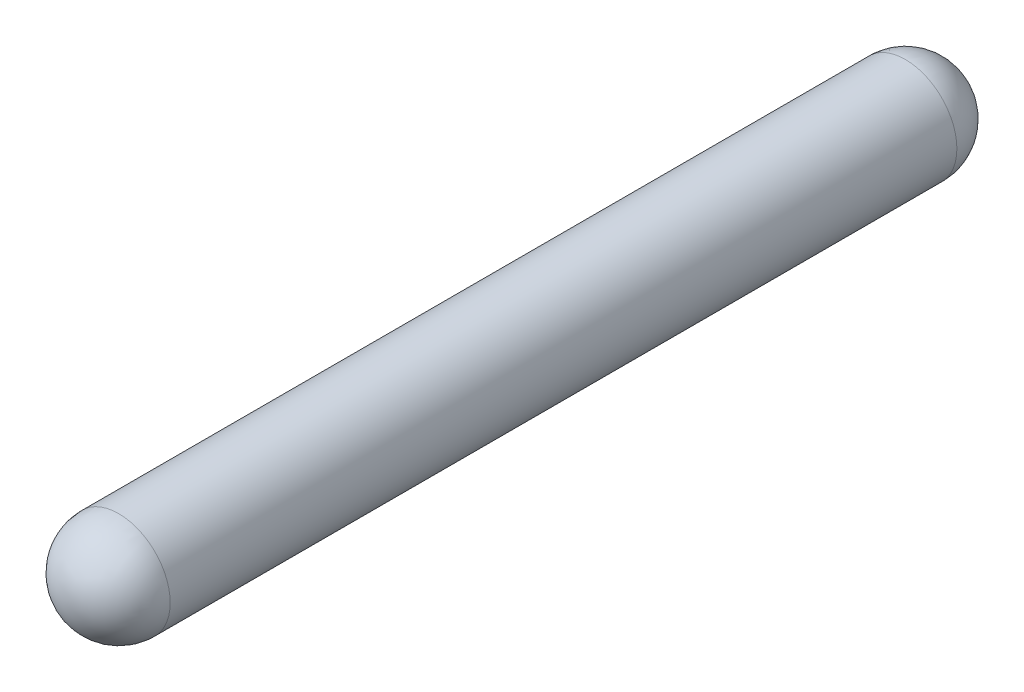
ISO-10303-21;
HEADER;
FILE_DESCRIPTION(('STEP AP214'),'2;1');
FILE_NAME('part.step','',(''),(''),'','','');
FILE_SCHEMA(('AUTOMOTIVE_DESIGN { 1 0 10303 214 1 1 1 1 }'));
ENDSEC;
DATA;
#1=APPLICATION_CONTEXT('core data for automotive mechanical design processes');
#2=APPLICATION_PROTOCOL_DEFINITION('international standard','automotive_design',2000,#1);
#3=PRODUCT_CONTEXT('',#1,'mechanical');
#4=PRODUCT('Part','Part','',(#3));
#5=PRODUCT_RELATED_PRODUCT_CATEGORY('part','',(#4));
#6=PRODUCT_DEFINITION_FORMATION('','',#4);
#7=PRODUCT_DEFINITION_CONTEXT('part definition',#1,'design');
#8=PRODUCT_DEFINITION('design','',#6,#7);
#9=PRODUCT_DEFINITION_SHAPE('','',#8);
#10=(LENGTH_UNIT() NAMED_UNIT(*) SI_UNIT(.MILLI.,.METRE.));
#11=(NAMED_UNIT(*) PLANE_ANGLE_UNIT() SI_UNIT($,.RADIAN.));
#12=(NAMED_UNIT(*) SI_UNIT($,.STERADIAN.) SOLID_ANGLE_UNIT());
#13=UNCERTAINTY_MEASURE_WITH_UNIT(LENGTH_MEASURE(1.E-05),#10,'distance_accuracy_value','');
#14=(GEOMETRIC_REPRESENTATION_CONTEXT(3) GLOBAL_UNCERTAINTY_ASSIGNED_CONTEXT((#13)) GLOBAL_UNIT_ASSIGNED_CONTEXT((#10,
#11,#12)) REPRESENTATION_CONTEXT('',''));
#15=CARTESIAN_POINT('',(0.,0.,0.));
#16=DIRECTION('',(0.,0.,1.));
#17=DIRECTION('',(1.,0.,0.));
#18=AXIS2_PLACEMENT_3D('',#15,#16,#17);
#19=CARTESIAN_POINT('',(20.32,2.54,-3.));
#20=DIRECTION('',(1.,0.,0.));
#21=DIRECTION('',(0.,-1.,0.));
#22=AXIS2_PLACEMENT_3D('',#19,#20,#21);
#23=SPHERICAL_SURFACE('',#22,0.458);
#24=CARTESIAN_POINT('',(20.32,2.54,-3.));
#25=DIRECTION('',(0.,0.,1.));
#26=DIRECTION('',(1.,0.,0.));
#27=AXIS2_PLACEMENT_3D('',#24,#25,#26);
#28=CIRCLE('',#27,0.458);
#29=CARTESIAN_POINT('',(20.778,2.54,-3.));
#30=VERTEX_POINT('',#29);
#31=CARTESIAN_POINT('',(19.862,2.54,-3.));
#32=VERTEX_POINT('',#31);
#33=EDGE_CURVE('E42',#30,#32,#28,.T.);
#34=ORIENTED_EDGE('',*,*,#33,.F.);
#35=CARTESIAN_POINT('',(20.32,2.54,-3.));
#36=DIRECTION('',(0.,0.,1.));
#37=DIRECTION('',(1.,0.,0.));
#38=AXIS2_PLACEMENT_3D('',#35,#36,#37);
#39=CIRCLE('',#38,0.458);
#40=EDGE_CURVE('E26',#32,#30,#39,.T.);
#41=ORIENTED_EDGE('',*,*,#40,.F.);
#42=EDGE_LOOP('',(#34,#41));
#43=FACE_BOUND('',#42,.T.);
#44=ADVANCED_FACE('F17',(#43),#23,.T.);
#45=CARTESIAN_POINT('',(20.32,2.54,4.));
#46=DIRECTION('',(1.,0.,0.));
#47=DIRECTION('',(0.,1.,0.));
#48=AXIS2_PLACEMENT_3D('',#45,#46,#47);
#49=SPHERICAL_SURFACE('',#48,0.458);
#50=CARTESIAN_POINT('',(20.32,2.54,4.));
#51=DIRECTION('',(0.,0.,1.));
#52=DIRECTION('',(1.,0.,0.));
#53=AXIS2_PLACEMENT_3D('',#50,#51,#52);
#54=CIRCLE('',#53,0.458);
#55=CARTESIAN_POINT('',(20.778,2.54,4.));
#56=VERTEX_POINT('',#55);
#57=CARTESIAN_POINT('',(19.862,2.54,4.));
#58=VERTEX_POINT('',#57);
#59=EDGE_CURVE('E11',#56,#58,#54,.F.);
#60=ORIENTED_EDGE('',*,*,#59,.F.);
#61=CARTESIAN_POINT('',(20.32,2.54,4.));
#62=DIRECTION('',(0.,0.,1.));
#63=DIRECTION('',(1.,0.,0.));
#64=AXIS2_PLACEMENT_3D('',#61,#62,#63);
#65=CIRCLE('',#64,0.458);
#66=EDGE_CURVE('E34',#58,#56,#65,.F.);
#67=ORIENTED_EDGE('',*,*,#66,.F.);
#68=EDGE_LOOP('',(#60,#67));
#69=FACE_BOUND('',#68,.T.);
#70=ADVANCED_FACE('F49',(#69),#49,.T.);
#71=CARTESIAN_POINT('',(20.32,2.54,-3.));
#72=DIRECTION('',(0.,0.,1.));
#73=DIRECTION('',(1.,0.,0.));
#74=AXIS2_PLACEMENT_3D('',#71,#72,#73);
#75=CYLINDRICAL_SURFACE('',#74,0.458);
#76=ORIENTED_EDGE('',*,*,#66,.T.);
#77=ORIENTED_EDGE('',*,*,#59,.T.);
#78=EDGE_LOOP('',(#76,#77));
#79=FACE_BOUND('',#78,.T.);
#80=ORIENTED_EDGE('',*,*,#40,.T.);
#81=ORIENTED_EDGE('',*,*,#33,.T.);
#82=EDGE_LOOP('',(#80,#81));
#83=FACE_BOUND('',#82,.T.);
#84=ADVANCED_FACE('F45',(#79,#83),#75,.T.);
#85=CLOSED_SHELL('',(#44,#70,#84));
#86=MANIFOLD_SOLID_BREP('B1',#85);
#87=ADVANCED_BREP_SHAPE_REPRESENTATION('',(#18,#86),#14);
#88=SHAPE_DEFINITION_REPRESENTATION(#9,#87);
ENDSEC;
END-ISO-10303-21;
